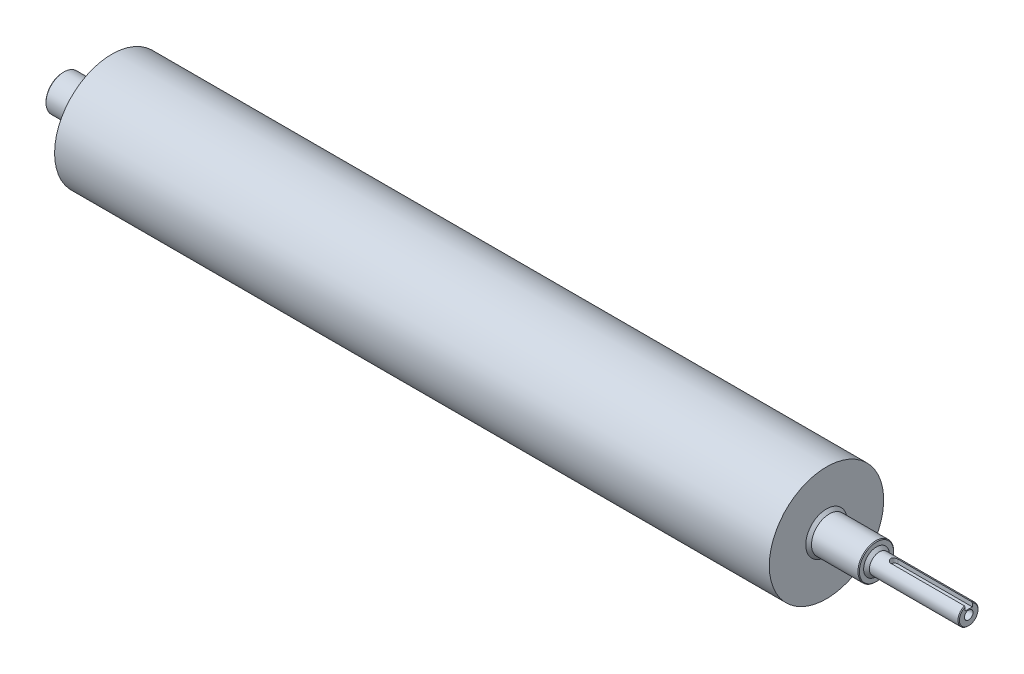
ISO-10303-21;
HEADER;
FILE_DESCRIPTION(('STEP AP214'),'2;1');
FILE_NAME('part.step','',(''),(''),'','','');
FILE_SCHEMA(('AUTOMOTIVE_DESIGN { 1 0 10303 214 1 1 1 1 }'));
ENDSEC;
DATA;
#1=APPLICATION_CONTEXT('core data for automotive mechanical design processes');
#2=APPLICATION_PROTOCOL_DEFINITION('international standard','automotive_design',2000,#1);
#3=PRODUCT_CONTEXT('',#1,'mechanical');
#4=PRODUCT('Part','Part','',(#3));
#5=PRODUCT_RELATED_PRODUCT_CATEGORY('part','',(#4));
#6=PRODUCT_DEFINITION_FORMATION('','',#4);
#7=PRODUCT_DEFINITION_CONTEXT('part definition',#1,'design');
#8=PRODUCT_DEFINITION('design','',#6,#7);
#9=PRODUCT_DEFINITION_SHAPE('','',#8);
#10=(LENGTH_UNIT() NAMED_UNIT(*) SI_UNIT(.MILLI.,.METRE.));
#11=(NAMED_UNIT(*) PLANE_ANGLE_UNIT() SI_UNIT($,.RADIAN.));
#12=(NAMED_UNIT(*) SI_UNIT($,.STERADIAN.) SOLID_ANGLE_UNIT());
#13=UNCERTAINTY_MEASURE_WITH_UNIT(LENGTH_MEASURE(1.E-05),#10,'distance_accuracy_value','');
#14=(GEOMETRIC_REPRESENTATION_CONTEXT(3) GLOBAL_UNCERTAINTY_ASSIGNED_CONTEXT((#13)) GLOBAL_UNIT_ASSIGNED_CONTEXT((#10,
#11,#12)) REPRESENTATION_CONTEXT('',''));
#15=CARTESIAN_POINT('',(0.,0.,0.));
#16=DIRECTION('',(0.,0.,1.));
#17=DIRECTION('',(1.,0.,0.));
#18=AXIS2_PLACEMENT_3D('',#15,#16,#17);
#19=CARTESIAN_POINT('',(633.5,0.,0.));
#20=DIRECTION('',(-1.,0.,0.));
#21=DIRECTION('',(0.,0.,1.));
#22=AXIS2_PLACEMENT_3D('',#19,#20,#21);
#23=CYLINDRICAL_SURFACE('',#22,7.);
#24=CARTESIAN_POINT('',(571.,0.,0.));
#25=DIRECTION('',(1.,0.,0.));
#26=DIRECTION('',(0.,0.,-1.));
#27=AXIS2_PLACEMENT_3D('',#24,#25,#26);
#28=CIRCLE('',#27,7.);
#29=CARTESIAN_POINT('',(571.,0.,-7.));
#30=VERTEX_POINT('',#29);
#31=EDGE_CURVE('E153',#30,#30,#28,.T.);
#32=ORIENTED_EDGE('',*,*,#31,.T.);
#33=EDGE_LOOP('',(#32));
#34=FACE_BOUND('',#33,.T.);
#35=CARTESIAN_POINT('',(581.5,6.53834841531101,-2.5));
#36=CARTESIAN_POINT('',(581.432110754271,6.53833653785132,-2.50000932220905));
#37=CARTESIAN_POINT('',(581.364228067361,6.53940549922738,-2.49723485076695));
#38=CARTESIAN_POINT('',(581.228996089388,6.54361657478134,-2.4861910211816));
#39=CARTESIAN_POINT('',(581.161646641394,6.54675805418062,-2.47792334551208));
#40=CARTESIAN_POINT('',(581.028178585397,6.55501217637942,-2.45600175285901));
#41=CARTESIAN_POINT('',(580.96205666366,6.56011831705675,-2.44236559963956));
#42=CARTESIAN_POINT('',(580.831298164891,6.57213177854174,-2.4098511546665));
#43=CARTESIAN_POINT('',(580.766661653687,6.57903917900746,-2.39097263107437));
#44=CARTESIAN_POINT('',(580.575735633522,6.6021493436571,-2.32673964179204));
#45=CARTESIAN_POINT('',(580.452209547864,6.62075475340845,-2.27375112606985));
#46=CARTESIAN_POINT('',(580.215769666872,6.66225397360711,-2.14910757865423));
#47=CARTESIAN_POINT('',(580.102863683264,6.68515090424876,-2.07743895048848));
#48=CARTESIAN_POINT('',(579.885784786647,6.73379913792223,-1.91402571101971));
#49=CARTESIAN_POINT('',(579.782153524804,6.75962864041371,-1.82158337146746));
#50=CARTESIAN_POINT('',(579.591491295284,6.8105759232303,-1.62073388776333));
#51=CARTESIAN_POINT('',(579.504463420757,6.83569357019867,-1.51232377552677));
#52=CARTESIAN_POINT('',(579.346910144545,6.88331133279045,-1.27853915335939));
#53=CARTESIAN_POINT('',(579.276968478139,6.90570835223796,-1.1527483378919));
#54=CARTESIAN_POINT('',(579.159463353203,6.94442357672633,-0.890250825476675));
#55=CARTESIAN_POINT('',(579.111892220954,6.96074386585465,-0.753547890540354));
#56=CARTESIAN_POINT('',(579.042359397818,6.9849105051071,-0.478829979256188));
#57=CARTESIAN_POINT('',(579.019460869529,6.99306594352515,-0.341079835227478));
#58=CARTESIAN_POINT('',(578.996931597222,7.00108798053822,-0.0634643052969072));
#59=CARTESIAN_POINT('',(578.997294413965,7.00095687302702,0.0764004845074516));
#60=CARTESIAN_POINT('',(579.020711273761,6.99262258049077,0.34759325848696));
#61=CARTESIAN_POINT('',(579.042744794198,6.98478243583516,0.479022407078739));
#62=CARTESIAN_POINT('',(579.107173424159,6.96237832507347,0.736175812143629));
#63=CARTESIAN_POINT('',(579.149569684363,6.94781397899037,0.861899745780483));
#64=CARTESIAN_POINT('',(579.254046911565,6.91316506890368,1.10616102429809));
#65=CARTESIAN_POINT('',(579.31639571496,6.89300592164314,1.22457279066908));
#66=CARTESIAN_POINT('',(579.458779335223,6.8492335561632,1.44953531305525));
#67=CARTESIAN_POINT('',(579.538819523783,6.82561928959263,1.55608245176773));
#68=CARTESIAN_POINT('',(579.719323263657,6.77590547805489,1.76032445256074));
#69=CARTESIAN_POINT('',(579.820649723145,6.74974055843874,1.85724185700423));
#70=CARTESIAN_POINT('',(580.038327364166,6.69890342468975,2.03299914621298));
#71=CARTESIAN_POINT('',(580.154683905168,6.67423174765257,2.1118325545646));
#72=CARTESIAN_POINT('',(580.401942598522,6.62877803875406,2.25049860898455));
#73=CARTESIAN_POINT('',(580.533078975505,6.60807875118995,2.30994207989624));
#74=CARTESIAN_POINT('',(580.804364801582,6.57388213610267,2.4055543972585));
#75=CARTESIAN_POINT('',(580.944499141169,6.56037307165054,2.44176119399954));
#76=CARTESIAN_POINT('',(581.155030544264,6.54708542245562,2.47705497148626));
#77=CARTESIAN_POINT('',(581.223736301772,6.54382010967907,2.48565347586444));
#78=CARTESIAN_POINT('',(581.361615164191,6.53944910829677,2.49712352174881));
#79=CARTESIAN_POINT('',(581.4307876671,6.53834103140935,2.50000139665367));
#80=CARTESIAN_POINT('',(581.5,6.53834841531101,2.5));
#81=B_SPLINE_CURVE_WITH_KNOTS('',3,(#35,#36,#37,#38,#39,#40,#41,#42,#43,#44,#45,#46,#47,#48,#49,
#50,#51,#52,#53,#54,#55,#56,#57,#58,#59,#60,#61,#62,#63,#64,#65,#66,#67,#68,#69,#70,#71,#72,#73,
#74,#75,#76,#77,#78,#79,#80),.UNSPECIFIED.,.F.,.F.,(4,2,2,2,2,2,2,2,2,2,2,2,2,2,2,2,2,2,2,2,2,2,
4),(0.,0.203591628551613,0.407120929225424,0.609982356545697,0.812852756635974,1.21793118555519,
1.62330528148463,2.04515972311929,2.46709267811831,2.90188398965554,3.33652604665234,
3.7540099394086,4.17137826416922,4.56998920861349,4.96862268086887,5.37284909448643,
5.77719841367923,6.20315837945089,6.62927065674716,7.06347329058497,7.49696496492438,
7.70468580162762,7.9121765389639),.UNSPECIFIED.);
#82=CARTESIAN_POINT('',(581.5,6.53834841531101,-2.5));
#83=VERTEX_POINT('',#82);
#84=CARTESIAN_POINT('',(581.5,6.53834841531101,2.5));
#85=VERTEX_POINT('',#84);
#86=EDGE_CURVE('E93',#83,#85,#81,.T.);
#87=ORIENTED_EDGE('',*,*,#86,.F.);
#88=DIRECTION('',(1.,0.,0.));
#89=VECTOR('',#88,1.);
#90=CARTESIAN_POINT('',(581.5,6.53834841531101,-2.5));
#91=LINE('',#90,#89);
#92=CARTESIAN_POINT('',(633.,6.53834841531101,-2.5));
#93=VERTEX_POINT('',#92);
#94=EDGE_CURVE('E105',#83,#93,#91,.T.);
#95=ORIENTED_EDGE('',*,*,#94,.T.);
#96=CARTESIAN_POINT('',(633.,0.,0.));
#97=DIRECTION('',(1.,0.,0.));
#98=DIRECTION('',(0.,0.,-1.));
#99=AXIS2_PLACEMENT_3D('',#96,#97,#98);
#100=CIRCLE('',#99,7.);
#101=CARTESIAN_POINT('',(633.,6.53834841531101,2.5));
#102=VERTEX_POINT('',#101);
#103=EDGE_CURVE('E168',#93,#102,#100,.F.);
#104=ORIENTED_EDGE('',*,*,#103,.T.);
#105=DIRECTION('',(1.,0.,0.));
#106=VECTOR('',#105,1.);
#107=CARTESIAN_POINT('',(581.5,6.53834841531101,2.5));
#108=LINE('',#107,#106);
#109=EDGE_CURVE('E52',#85,#102,#108,.T.);
#110=ORIENTED_EDGE('',*,*,#109,.F.);
#111=EDGE_LOOP('',(#87,#95,#104,#110));
#112=FACE_BOUND('',#111,.T.);
#113=ADVANCED_FACE('F32',(#34,#112),#23,.T.);
#114=CARTESIAN_POINT('',(569.,0.,0.));
#115=DIRECTION('',(-1.,0.,0.));
#116=DIRECTION('',(0.,0.,1.));
#117=AXIS2_PLACEMENT_3D('',#114,#115,#116);
#118=CYLINDRICAL_SURFACE('',#117,12.5);
#119=CARTESIAN_POINT('',(568.5,0.,0.));
#120=DIRECTION('',(1.,0.,0.));
#121=DIRECTION('',(0.,0.,-1.));
#122=AXIS2_PLACEMENT_3D('',#119,#120,#121);
#123=CIRCLE('',#122,12.5);
#124=CARTESIAN_POINT('',(568.5,0.,-12.5));
#125=VERTEX_POINT('',#124);
#126=EDGE_CURVE('E174',#125,#125,#123,.F.);
#127=ORIENTED_EDGE('',*,*,#126,.T.);
#128=EDGE_LOOP('',(#127));
#129=FACE_BOUND('',#128,.T.);
#130=CARTESIAN_POINT('',(536.,0.,0.));
#131=DIRECTION('',(-1.,0.,0.));
#132=DIRECTION('',(0.,0.,1.));
#133=AXIS2_PLACEMENT_3D('',#130,#131,#132);
#134=CIRCLE('',#133,12.5);
#135=CARTESIAN_POINT('',(536.,0.,12.5));
#136=VERTEX_POINT('',#135);
#137=EDGE_CURVE('E150',#136,#136,#134,.F.);
#138=ORIENTED_EDGE('',*,*,#137,.T.);
#139=EDGE_LOOP('',(#138));
#140=FACE_BOUND('',#139,.T.);
#141=ADVANCED_FACE('F227',(#129,#140),#118,.T.);
#142=CARTESIAN_POINT('',(569.,0.,0.));
#143=DIRECTION('',(1.,0.,0.));
#144=DIRECTION('',(0.,0.,-1.));
#145=AXIS2_PLACEMENT_3D('',#142,#143,#144);
#146=PLANE('',#145);
#147=CARTESIAN_POINT('',(569.,0.,0.));
#148=DIRECTION('',(1.,0.,0.));
#149=DIRECTION('',(0.,0.,-1.));
#150=AXIS2_PLACEMENT_3D('',#147,#148,#149);
#151=CIRCLE('',#150,12.);
#152=CARTESIAN_POINT('',(569.,0.,-12.));
#153=VERTEX_POINT('',#152);
#154=EDGE_CURVE('E171',#153,#153,#151,.T.);
#155=ORIENTED_EDGE('',*,*,#154,.T.);
#156=EDGE_LOOP('',(#155));
#157=FACE_BOUND('',#156,.T.);
#158=CARTESIAN_POINT('',(569.,0.,0.));
#159=DIRECTION('',(1.,0.,0.));
#160=DIRECTION('',(0.,0.,-1.));
#161=AXIS2_PLACEMENT_3D('',#158,#159,#160);
#162=CIRCLE('',#161,9.00000000000017);
#163=CARTESIAN_POINT('',(569.,0.,-9.00000000000017));
#164=VERTEX_POINT('',#163);
#165=EDGE_CURVE('E156',#164,#164,#162,.F.);
#166=ORIENTED_EDGE('',*,*,#165,.T.);
#167=EDGE_LOOP('',(#166));
#168=FACE_BOUND('',#167,.T.);
#169=ADVANCED_FACE('F222',(#157,#168),#146,.T.);
#170=CARTESIAN_POINT('',(633.5,0.,0.));
#171=DIRECTION('',(1.,0.,0.));
#172=DIRECTION('',(0.,0.,-1.));
#173=AXIS2_PLACEMENT_3D('',#170,#171,#172);
#174=PLANE('',#173);
#175=DIRECTION('',(0.,1.,0.));
#176=VECTOR('',#175,1.);
#177=CARTESIAN_POINT('',(633.5,6.53834841531101,-2.5));
#178=LINE('',#177,#176);
#179=CARTESIAN_POINT('',(633.5,3.65,-2.5));
#180=VERTEX_POINT('',#179);
#181=CARTESIAN_POINT('',(633.5,6.00000000000001,-2.5));
#182=VERTEX_POINT('',#181);
#183=EDGE_CURVE('E118',#180,#182,#178,.T.);
#184=ORIENTED_EDGE('',*,*,#183,.F.);
#185=DIRECTION('',(0.,0.,-1.));
#186=VECTOR('',#185,1.);
#187=CARTESIAN_POINT('',(633.5,3.65,2.5));
#188=LINE('',#187,#186);
#189=CARTESIAN_POINT('',(633.5,3.65,2.5));
#190=VERTEX_POINT('',#189);
#191=EDGE_CURVE('E99',#190,#180,#188,.T.);
#192=ORIENTED_EDGE('',*,*,#191,.F.);
#193=DIRECTION('',(0.,-1.,0.));
#194=VECTOR('',#193,1.);
#195=CARTESIAN_POINT('',(633.5,6.53834841531101,2.5));
#196=LINE('',#195,#194);
#197=CARTESIAN_POINT('',(633.5,6.00000000000001,2.5));
#198=VERTEX_POINT('',#197);
#199=EDGE_CURVE('E108',#198,#190,#196,.T.);
#200=ORIENTED_EDGE('',*,*,#199,.F.);
#201=CARTESIAN_POINT('',(633.5,0.,0.));
#202=DIRECTION('',(1.,0.,0.));
#203=DIRECTION('',(0.,0.,-1.));
#204=AXIS2_PLACEMENT_3D('',#201,#202,#203);
#205=CIRCLE('',#204,6.50000000000001);
#206=EDGE_CURVE('E165',#198,#182,#205,.T.);
#207=ORIENTED_EDGE('',*,*,#206,.T.);
#208=EDGE_LOOP('',(#184,#192,#200,#207));
#209=FACE_BOUND('',#208,.T.);
#210=CARTESIAN_POINT('',(633.5,0.,0.));
#211=DIRECTION('',(1.,0.,0.));
#212=DIRECTION('',(0.,0.,-1.));
#213=AXIS2_PLACEMENT_3D('',#210,#211,#212);
#214=CIRCLE('',#213,3.);
#215=CARTESIAN_POINT('',(633.5,0.,-3.));
#216=VERTEX_POINT('',#215);
#217=EDGE_CURVE('E133',#216,#216,#214,.T.);
#218=ORIENTED_EDGE('',*,*,#217,.F.);
#219=EDGE_LOOP('',(#218));
#220=FACE_BOUND('',#219,.T.);
#221=ADVANCED_FACE('F219',(#209,#220),#174,.T.);
#222=CARTESIAN_POINT('',(613.5,0.,0.));
#223=DIRECTION('',(1.,0.,0.));
#224=DIRECTION('',(0.,0.,-1.));
#225=AXIS2_PLACEMENT_3D('',#222,#223,#224);
#226=CYLINDRICAL_SURFACE('',#225,3.);
#227=CARTESIAN_POINT('',(613.5,0.,0.));
#228=DIRECTION('',(1.,0.,0.));
#229=DIRECTION('',(0.,0.,-1.));
#230=AXIS2_PLACEMENT_3D('',#227,#228,#229);
#231=CIRCLE('',#230,3.);
#232=CARTESIAN_POINT('',(613.5,0.,-3.));
#233=VERTEX_POINT('',#232);
#234=EDGE_CURVE('E136',#233,#233,#231,.T.);
#235=ORIENTED_EDGE('',*,*,#234,.F.);
#236=EDGE_LOOP('',(#235));
#237=FACE_BOUND('',#236,.T.);
#238=ORIENTED_EDGE('',*,*,#217,.T.);
#239=EDGE_LOOP('',(#238));
#240=FACE_BOUND('',#239,.T.);
#241=ADVANCED_FACE('F215',(#237,#240),#226,.F.);
#242=CARTESIAN_POINT('',(613.5,0.,0.));
#243=DIRECTION('',(1.,0.,0.));
#244=DIRECTION('',(0.,0.,-1.));
#245=AXIS2_PLACEMENT_3D('',#242,#243,#244);
#246=PLANE('',#245);
#247=ORIENTED_EDGE('',*,*,#234,.T.);
#248=EDGE_LOOP('',(#247));
#249=FACE_BOUND('',#248,.T.);
#250=ADVANCED_FACE('F195',(#249),#246,.T.);
#251=CARTESIAN_POINT('',(534.,0.,0.));
#252=DIRECTION('',(-1.,0.,0.));
#253=DIRECTION('',(0.,0.,1.));
#254=AXIS2_PLACEMENT_3D('',#251,#252,#253);
#255=PLANE('',#254);
#256=CARTESIAN_POINT('',(534.,0.,0.));
#257=DIRECTION('',(-1.,0.,0.));
#258=DIRECTION('',(0.,0.,1.));
#259=AXIS2_PLACEMENT_3D('',#256,#257,#258);
#260=CIRCLE('',#259,14.5);
#261=CARTESIAN_POINT('',(534.,0.,14.5));
#262=VERTEX_POINT('',#261);
#263=EDGE_CURVE('E147',#262,#262,#260,.T.);
#264=ORIENTED_EDGE('',*,*,#263,.T.);
#265=EDGE_LOOP('',(#264));
#266=FACE_BOUND('',#265,.T.);
#267=CARTESIAN_POINT('',(534.,0.,0.));
#268=DIRECTION('',(-1.,0.,0.));
#269=DIRECTION('',(0.,0.,1.));
#270=AXIS2_PLACEMENT_3D('',#267,#268,#269);
#271=CIRCLE('',#270,40.);
#272=CARTESIAN_POINT('',(534.,0.,40.));
#273=VERTEX_POINT('',#272);
#274=EDGE_CURVE('E124',#273,#273,#271,.T.);
#275=ORIENTED_EDGE('',*,*,#274,.F.);
#276=EDGE_LOOP('',(#275));
#277=FACE_BOUND('',#276,.T.);
#278=ADVANCED_FACE('F191',(#266,#277),#255,.F.);
#279=CARTESIAN_POINT('',(34.,0.,0.));
#280=DIRECTION('',(-1.,0.,0.));
#281=DIRECTION('',(0.,0.,1.));
#282=AXIS2_PLACEMENT_3D('',#279,#280,#281);
#283=PLANE('',#282);
#284=CARTESIAN_POINT('',(34.,0.,0.));
#285=DIRECTION('',(-1.,0.,0.));
#286=DIRECTION('',(0.,0.,1.));
#287=AXIS2_PLACEMENT_3D('',#284,#285,#286);
#288=CIRCLE('',#287,14.5);
#289=CARTESIAN_POINT('',(34.,0.,14.5));
#290=VERTEX_POINT('',#289);
#291=EDGE_CURVE('E144',#290,#290,#288,.F.);
#292=ORIENTED_EDGE('',*,*,#291,.T.);
#293=EDGE_LOOP('',(#292));
#294=FACE_BOUND('',#293,.T.);
#295=CARTESIAN_POINT('',(34.,0.,0.));
#296=DIRECTION('',(-1.,0.,0.));
#297=DIRECTION('',(0.,0.,1.));
#298=AXIS2_PLACEMENT_3D('',#295,#296,#297);
#299=CIRCLE('',#298,40.);
#300=CARTESIAN_POINT('',(34.,0.,40.));
#301=VERTEX_POINT('',#300);
#302=EDGE_CURVE('E101',#301,#301,#299,.T.);
#303=ORIENTED_EDGE('',*,*,#302,.T.);
#304=EDGE_LOOP('',(#303));
#305=FACE_BOUND('',#304,.T.);
#306=ADVANCED_FACE('F194',(#294,#305),#283,.T.);
#307=CARTESIAN_POINT('',(534.,0.,0.));
#308=DIRECTION('',(-1.,0.,0.));
#309=DIRECTION('',(0.,0.,1.));
#310=AXIS2_PLACEMENT_3D('',#307,#308,#309);
#311=CYLINDRICAL_SURFACE('',#310,40.);
#312=ORIENTED_EDGE('',*,*,#274,.T.);
#313=EDGE_LOOP('',(#312));
#314=FACE_BOUND('',#313,.T.);
#315=ORIENTED_EDGE('',*,*,#302,.F.);
#316=EDGE_LOOP('',(#315));
#317=FACE_BOUND('',#316,.T.);
#318=ADVANCED_FACE('F199',(#314,#317),#311,.T.);
#319=CARTESIAN_POINT('',(20.,0.,0.));
#320=DIRECTION('',(-1.,0.,0.));
#321=DIRECTION('',(0.,0.,1.));
#322=AXIS2_PLACEMENT_3D('',#319,#320,#321);
#323=PLANE('',#322);
#324=CARTESIAN_POINT('',(20.,0.,0.));
#325=DIRECTION('',(-1.,0.,0.));
#326=DIRECTION('',(0.,0.,1.));
#327=AXIS2_PLACEMENT_3D('',#324,#325,#326);
#328=CIRCLE('',#327,3.);
#329=CARTESIAN_POINT('',(20.,0.,3.));
#330=VERTEX_POINT('',#329);
#331=EDGE_CURVE('E130',#330,#330,#328,.T.);
#332=ORIENTED_EDGE('',*,*,#331,.T.);
#333=EDGE_LOOP('',(#332));
#334=FACE_BOUND('',#333,.T.);
#335=ADVANCED_FACE('F203',(#334),#323,.T.);
#336=CARTESIAN_POINT('',(20.,0.,0.));
#337=DIRECTION('',(-1.,0.,0.));
#338=DIRECTION('',(0.,0.,1.));
#339=AXIS2_PLACEMENT_3D('',#336,#337,#338);
#340=CYLINDRICAL_SURFACE('',#339,3.);
#341=ORIENTED_EDGE('',*,*,#331,.F.);
#342=EDGE_LOOP('',(#341));
#343=FACE_BOUND('',#342,.T.);
#344=CARTESIAN_POINT('',(0.,0.,0.));
#345=DIRECTION('',(-1.,0.,0.));
#346=DIRECTION('',(0.,0.,1.));
#347=AXIS2_PLACEMENT_3D('',#344,#345,#346);
#348=CIRCLE('',#347,3.);
#349=CARTESIAN_POINT('',(0.,0.,3.));
#350=VERTEX_POINT('',#349);
#351=EDGE_CURVE('E127',#350,#350,#348,.T.);
#352=ORIENTED_EDGE('',*,*,#351,.T.);
#353=EDGE_LOOP('',(#352));
#354=FACE_BOUND('',#353,.T.);
#355=ADVANCED_FACE('F207',(#343,#354),#340,.F.);
#356=CARTESIAN_POINT('',(0.,0.,0.));
#357=DIRECTION('',(1.,0.,0.));
#358=DIRECTION('',(0.,0.,-1.));
#359=AXIS2_PLACEMENT_3D('',#356,#357,#358);
#360=PLANE('',#359);
#361=CARTESIAN_POINT('',(0.,0.,0.));
#362=DIRECTION('',(1.,0.,0.));
#363=DIRECTION('',(0.,0.,-1.));
#364=AXIS2_PLACEMENT_3D('',#361,#362,#363);
#365=CIRCLE('',#364,12.0000000000002);
#366=CARTESIAN_POINT('',(0.,0.,-12.0000000000002));
#367=VERTEX_POINT('',#366);
#368=EDGE_CURVE('E162',#367,#367,#365,.F.);
#369=ORIENTED_EDGE('',*,*,#368,.T.);
#370=EDGE_LOOP('',(#369));
#371=FACE_BOUND('',#370,.T.);
#372=ORIENTED_EDGE('',*,*,#351,.F.);
#373=EDGE_LOOP('',(#372));
#374=FACE_BOUND('',#373,.T.);
#375=ADVANCED_FACE('F211',(#371,#374),#360,.F.);
#376=CARTESIAN_POINT('',(0.499999999999834,0.,0.));
#377=DIRECTION('',(1.,0.,0.));
#378=DIRECTION('',(0.,0.,-1.));
#379=AXIS2_PLACEMENT_3D('',#376,#377,#378);
#380=CIRCLE('',#379,12.5);
#381=CARTESIAN_POINT('',(0.499999999999834,0.,-12.5));
#382=VERTEX_POINT('',#381);
#383=EDGE_CURVE('E159',#382,#382,#380,.T.);
#384=ORIENTED_EDGE('',*,*,#383,.T.);
#385=EDGE_LOOP('',(#384));
#386=FACE_BOUND('',#385,.T.);
#387=CARTESIAN_POINT('',(32.,0.,0.));
#388=DIRECTION('',(-1.,0.,0.));
#389=DIRECTION('',(0.,0.,1.));
#390=AXIS2_PLACEMENT_3D('',#387,#388,#389);
#391=CIRCLE('',#390,12.5);
#392=CARTESIAN_POINT('',(32.,0.,12.5));
#393=VERTEX_POINT('',#392);
#394=EDGE_CURVE('E139',#393,#393,#391,.T.);
#395=ORIENTED_EDGE('',*,*,#394,.T.);
#396=EDGE_LOOP('',(#395));
#397=FACE_BOUND('',#396,.T.);
#398=ADVANCED_FACE('F234',(#386,#397),#118,.T.);
#399=CARTESIAN_POINT('',(32.,0.,0.));
#400=DIRECTION('',(1.,0.,0.));
#401=DIRECTION('',(0.,0.,-1.));
#402=AXIS2_PLACEMENT_3D('',#399,#400,#401);
#403=CONICAL_SURFACE('',#402,12.5,0.785398163397451);
#404=ORIENTED_EDGE('',*,*,#291,.F.);
#405=EDGE_LOOP('',(#404));
#406=FACE_BOUND('',#405,.T.);
#407=ORIENTED_EDGE('',*,*,#394,.F.);
#408=EDGE_LOOP('',(#407));
#409=FACE_BOUND('',#408,.T.);
#410=ADVANCED_FACE('F238',(#406,#409),#403,.T.);
#411=CARTESIAN_POINT('',(534.,0.,0.));
#412=DIRECTION('',(-1.,0.,0.));
#413=DIRECTION('',(0.,0.,1.));
#414=AXIS2_PLACEMENT_3D('',#411,#412,#413);
#415=CONICAL_SURFACE('',#414,14.5,0.78539816339745);
#416=ORIENTED_EDGE('',*,*,#137,.F.);
#417=EDGE_LOOP('',(#416));
#418=FACE_BOUND('',#417,.T.);
#419=ORIENTED_EDGE('',*,*,#263,.F.);
#420=EDGE_LOOP('',(#419));
#421=FACE_BOUND('',#420,.T.);
#422=ADVANCED_FACE('F242',(#418,#421),#415,.T.);
#423=CARTESIAN_POINT('',(571.,0.,0.));
#424=DIRECTION('',(-1.,0.,0.));
#425=DIRECTION('',(0.,0.,1.));
#426=AXIS2_PLACEMENT_3D('',#423,#424,#425);
#427=CONICAL_SURFACE('',#426,7.,0.785398163397464);
#428=ORIENTED_EDGE('',*,*,#165,.F.);
#429=EDGE_LOOP('',(#428));
#430=FACE_BOUND('',#429,.T.);
#431=ORIENTED_EDGE('',*,*,#31,.F.);
#432=EDGE_LOOP('',(#431));
#433=FACE_BOUND('',#432,.T.);
#434=ADVANCED_FACE('F246',(#430,#433),#427,.T.);
#435=CARTESIAN_POINT('',(0.499999999999834,0.,0.));
#436=DIRECTION('',(1.,0.,0.));
#437=DIRECTION('',(0.,0.,-1.));
#438=AXIS2_PLACEMENT_3D('',#435,#436,#437);
#439=CONICAL_SURFACE('',#438,12.5,0.785398163397438);
#440=ORIENTED_EDGE('',*,*,#368,.F.);
#441=EDGE_LOOP('',(#440));
#442=FACE_BOUND('',#441,.T.);
#443=ORIENTED_EDGE('',*,*,#383,.F.);
#444=EDGE_LOOP('',(#443));
#445=FACE_BOUND('',#444,.T.);
#446=ADVANCED_FACE('F249',(#442,#445),#439,.T.);
#447=CARTESIAN_POINT('',(633.5,0.,0.));
#448=DIRECTION('',(-1.,0.,0.));
#449=DIRECTION('',(0.,0.,1.));
#450=AXIS2_PLACEMENT_3D('',#447,#448,#449);
#451=CONICAL_SURFACE('',#450,6.50000000000001,0.785398163397387);
#452=CARTESIAN_POINT('',(636.763406282255,2.05561156198136,-2.5));
#453=CARTESIAN_POINT('',(636.720647670997,2.12291946889995,-2.5));
#454=CARTESIAN_POINT('',(636.677016323681,2.18966321374387,-2.5));
#455=CARTESIAN_POINT('',(636.588268185576,2.32214271506774,-2.5));
#456=CARTESIAN_POINT('',(636.543151615,2.38787861888032,-2.5));
#457=CARTESIAN_POINT('',(636.405995934129,2.58371127758987,-2.5));
#458=CARTESIAN_POINT('',(636.312102320112,2.71250819066264,-2.5));
#459=CARTESIAN_POINT('',(636.120882739203,2.96725546398873,-2.5));
#460=CARTESIAN_POINT('',(636.023561187644,3.09320916616127,-2.5));
#461=CARTESIAN_POINT('',(635.826261932948,3.34304620393511,-2.5));
#462=CARTESIAN_POINT('',(635.726283797111,3.46692919684293,-2.5));
#463=CARTESIAN_POINT('',(635.524502415054,3.71281605849721,-2.5));
#464=CARTESIAN_POINT('',(635.4227028394,3.83482294843263,-2.5));
#465=CARTESIAN_POINT('',(635.217546169393,4.07750531951185,-2.5));
#466=CARTESIAN_POINT('',(635.114189163745,4.19818087580832,-2.5));
#467=CARTESIAN_POINT('',(634.802209502645,4.55868748817919,-2.5));
#468=CARTESIAN_POINT('',(634.591741870794,4.79692180076185,-2.5));
#469=CARTESIAN_POINT('',(634.290344287042,5.13342841595519,-2.5));
#470=CARTESIAN_POINT('',(634.200738088836,5.23289613459466,-2.5));
#471=CARTESIAN_POINT('',(634.02103513267,5.43137252510834,-2.5));
#472=CARTESIAN_POINT('',(633.930938417944,5.5303812360588,-2.5));
#473=CARTESIAN_POINT('',(633.659943100962,5.8268998423724,-2.5));
#474=CARTESIAN_POINT('',(633.478407028183,6.02382684154269,-2.5));
#475=CARTESIAN_POINT('',(632.989318800121,6.55095044177167,-2.5));
#476=CARTESIAN_POINT('',(632.680600108071,6.88006345284734,-2.5));
#477=CARTESIAN_POINT('',(632.060806228438,7.53606226093692,-2.5));
#478=CARTESIAN_POINT('',(631.749731021786,7.86294803988787,-2.5));
#479=CARTESIAN_POINT('',(631.126308710475,8.51478120250814,-2.5));
#480=CARTESIAN_POINT('',(630.813963487207,8.83973038738381,-2.5));
#481=CARTESIAN_POINT('',(630.188078599506,9.48845569113512,-2.5));
#482=CARTESIAN_POINT('',(629.87453897582,9.81223184930491,-2.5));
#483=CARTESIAN_POINT('',(629.560608326694,10.1356252154807,-2.5));
#484=B_SPLINE_CURVE_WITH_KNOTS('',3,(#452,#453,#454,#455,#456,#457,#458,#459,#460,#461,#462,
#463,#464,#465,#466,#467,#468,#469,#470,#471,#472,#473,#474,#475,#476,#477,#478,#479,#480,#481,
#482,#483),.UNSPECIFIED.,.F.,.F.,(4,2,2,2,2,2,2,2,2,2,2,2,2,2,2,4),(0.,0.239204289040653,
0.478373269688448,0.956442900657989,1.43391778928085,1.91147093080832,2.38815106654845,
2.86480415497765,3.81840928247236,4.22004072000316,4.62163731375572,5.42513442577414,
6.77885159195288,8.13257972380231,9.48474609101336,10.8368667364955),.UNSPECIFIED.);
#485=EDGE_CURVE('E11',#182,#93,#484,.T.);
#486=ORIENTED_EDGE('',*,*,#485,.F.);
#487=ORIENTED_EDGE('',*,*,#206,.F.);
#488=CARTESIAN_POINT('',(629.560608326694,10.1356252154807,2.5));
#489=CARTESIAN_POINT('',(629.874939782886,9.81181853300378,2.5));
#490=CARTESIAN_POINT('',(630.188879564281,9.48762831871975,2.5));
#491=CARTESIAN_POINT('',(630.815492668951,8.83814244738083,2.5));
#492=CARTESIAN_POINT('',(631.128166215601,8.51284700574061,2.5));
#493=CARTESIAN_POINT('',(631.751514657877,7.86107516160865,2.5));
#494=CARTESIAN_POINT('',(632.06219146688,7.5346005907005,2.5));
#495=CARTESIAN_POINT('',(632.681257914743,6.87936266783043,2.5));
#496=CARTESIAN_POINT('',(632.989647093732,6.55059888012229,2.5));
#497=CARTESIAN_POINT('',(633.449829797428,6.0546253304344,2.5));
#498=CARTESIAN_POINT('',(633.602971436351,5.88866692181282,2.5));
#499=CARTESIAN_POINT('',(633.908096481998,5.55569520719304,2.5));
#500=CARTESIAN_POINT('',(634.060079918069,5.38868192812231,2.5));
#501=CARTESIAN_POINT('',(634.362487727648,5.05339353210887,2.5));
#502=CARTESIAN_POINT('',(634.512912815355,4.88511906020129,2.5));
#503=CARTESIAN_POINT('',(634.811816293218,4.54681651062759,2.5));
#504=CARTESIAN_POINT('',(634.960294493447,4.37678826472347,2.5));
#505=CARTESIAN_POINT('',(635.25484391445,4.0341282385271,2.5));
#506=CARTESIAN_POINT('',(635.40091038303,3.86149236447776,2.5));
#507=CARTESIAN_POINT('',(635.689253642288,3.5131382748118,2.5));
#508=CARTESIAN_POINT('',(635.831531440037,3.33742089931153,2.5));
#509=CARTESIAN_POINT('',(636.040901219645,3.07042179251093,2.5));
#510=CARTESIAN_POINT('',(636.110074202574,2.98077328049473,2.5));
#511=CARTESIAN_POINT('',(636.246675959279,2.80016678933021,2.5));
#512=CARTESIAN_POINT('',(636.314104887968,2.70920892760852,2.5));
#513=CARTESIAN_POINT('',(636.446861097605,2.52563715514851,2.5));
#514=CARTESIAN_POINT('',(636.512186418074,2.43302181799555,2.5));
#515=CARTESIAN_POINT('',(636.640051660151,2.24585019482836,2.5));
#516=CARTESIAN_POINT('',(636.702590713741,2.15129331717595,2.5));
#517=CARTESIAN_POINT('',(636.763406282255,2.05561156198137,2.5));
#518=B_SPLINE_CURVE_WITH_KNOTS('',3,(#488,#489,#490,#491,#492,#493,#494,#495,#496,#497,#498,
#499,#500,#501,#502,#503,#504,#505,#506,#507,#508,#509,#510,#511,#512,#513,#514,#515,#516,#517),
.UNSPECIFIED.,.F.,.F.,(4,2,2,2,2,2,2,2,2,2,2,2,2,2,4),(0.,1.35384801579792,2.70744577704101,
4.05945665030921,5.4117323218604,6.08918752002054,6.76662549425583,7.44373788239743,
8.12091584087722,8.79929856053951,9.47749912120906,9.81718213342873,10.1568348692777,
10.4967954889714,10.8368612878829),.UNSPECIFIED.);
#519=EDGE_CURVE('E45',#102,#198,#518,.T.);
#520=ORIENTED_EDGE('',*,*,#519,.F.);
#521=ORIENTED_EDGE('',*,*,#103,.F.);
#522=EDGE_LOOP('',(#486,#487,#520,#521));
#523=FACE_BOUND('',#522,.T.);
#524=ADVANCED_FACE('F181',(#523),#451,.T.);
#525=CARTESIAN_POINT('',(569.,0.,0.));
#526=DIRECTION('',(-1.,0.,0.));
#527=DIRECTION('',(0.,0.,1.));
#528=AXIS2_PLACEMENT_3D('',#525,#526,#527);
#529=CONICAL_SURFACE('',#528,12.,0.785398163397382);
#530=ORIENTED_EDGE('',*,*,#126,.F.);
#531=EDGE_LOOP('',(#530));
#532=FACE_BOUND('',#531,.T.);
#533=ORIENTED_EDGE('',*,*,#154,.F.);
#534=EDGE_LOOP('',(#533));
#535=FACE_BOUND('',#534,.T.);
#536=ADVANCED_FACE('F34',(#532,#535),#529,.T.);
#537=CARTESIAN_POINT('',(581.5,6.53834841531101,-2.5));
#538=DIRECTION('',(0.,0.,-1.));
#539=DIRECTION('',(0.,1.,0.));
#540=AXIS2_PLACEMENT_3D('',#537,#538,#539);
#541=PLANE('',#540);
#542=ORIENTED_EDGE('',*,*,#485,.T.);
#543=ORIENTED_EDGE('',*,*,#94,.F.);
#544=DIRECTION('',(0.,1.,0.));
#545=VECTOR('',#544,1.);
#546=CARTESIAN_POINT('',(581.5,6.53834841531101,-2.5));
#547=LINE('',#546,#545);
#548=CARTESIAN_POINT('',(581.5,3.65,-2.5));
#549=VERTEX_POINT('',#548);
#550=EDGE_CURVE('E87',#549,#83,#547,.T.);
#551=ORIENTED_EDGE('',*,*,#550,.F.);
#552=DIRECTION('',(1.,0.,0.));
#553=VECTOR('',#552,1.);
#554=CARTESIAN_POINT('',(581.5,3.65,-2.5));
#555=LINE('',#554,#553);
#556=EDGE_CURVE('E96',#549,#180,#555,.T.);
#557=ORIENTED_EDGE('',*,*,#556,.T.);
#558=ORIENTED_EDGE('',*,*,#183,.T.);
#559=EDGE_LOOP('',(#542,#543,#551,#557,#558));
#560=FACE_BOUND('',#559,.T.);
#561=ADVANCED_FACE('F104',(#560),#541,.F.);
#562=CARTESIAN_POINT('',(581.5,3.65,2.5));
#563=DIRECTION('',(0.,-1.,0.));
#564=DIRECTION('',(0.,0.,-1.));
#565=AXIS2_PLACEMENT_3D('',#562,#563,#564);
#566=PLANE('',#565);
#567=ORIENTED_EDGE('',*,*,#191,.T.);
#568=ORIENTED_EDGE('',*,*,#556,.F.);
#569=CARTESIAN_POINT('',(581.5,3.65,0.));
#570=DIRECTION('',(0.,1.,0.));
#571=DIRECTION('',(0.,0.,1.));
#572=AXIS2_PLACEMENT_3D('',#569,#570,#571);
#573=CIRCLE('',#572,2.5);
#574=CARTESIAN_POINT('',(581.5,3.65,2.5));
#575=VERTEX_POINT('',#574);
#576=EDGE_CURVE('E83',#549,#575,#573,.T.);
#577=ORIENTED_EDGE('',*,*,#576,.T.);
#578=DIRECTION('',(1.,0.,0.));
#579=VECTOR('',#578,1.);
#580=CARTESIAN_POINT('',(581.5,3.65,2.5));
#581=LINE('',#580,#579);
#582=EDGE_CURVE('E102',#575,#190,#581,.T.);
#583=ORIENTED_EDGE('',*,*,#582,.T.);
#584=EDGE_LOOP('',(#567,#568,#577,#583));
#585=FACE_BOUND('',#584,.T.);
#586=ADVANCED_FACE('F97',(#585),#566,.F.);
#587=CARTESIAN_POINT('',(581.5,6.53834841531101,2.5));
#588=DIRECTION('',(0.,0.,1.));
#589=DIRECTION('',(1.,0.,0.));
#590=AXIS2_PLACEMENT_3D('',#587,#588,#589);
#591=PLANE('',#590);
#592=ORIENTED_EDGE('',*,*,#519,.T.);
#593=ORIENTED_EDGE('',*,*,#199,.T.);
#594=ORIENTED_EDGE('',*,*,#582,.F.);
#595=DIRECTION('',(0.,-1.,0.));
#596=VECTOR('',#595,1.);
#597=CARTESIAN_POINT('',(581.5,6.53834841531101,2.5));
#598=LINE('',#597,#596);
#599=EDGE_CURVE('E89',#85,#575,#598,.T.);
#600=ORIENTED_EDGE('',*,*,#599,.F.);
#601=ORIENTED_EDGE('',*,*,#109,.T.);
#602=EDGE_LOOP('',(#592,#593,#594,#600,#601));
#603=FACE_BOUND('',#602,.T.);
#604=ADVANCED_FACE('F184',(#603),#591,.F.);
#605=CARTESIAN_POINT('',(581.5,13.65,0.));
#606=DIRECTION('',(0.,-1.,0.));
#607=DIRECTION('',(0.,0.,-1.));
#608=AXIS2_PLACEMENT_3D('',#605,#606,#607);
#609=CYLINDRICAL_SURFACE('',#608,2.5);
#610=ORIENTED_EDGE('',*,*,#86,.T.);
#611=ORIENTED_EDGE('',*,*,#599,.T.);
#612=ORIENTED_EDGE('',*,*,#576,.F.);
#613=ORIENTED_EDGE('',*,*,#550,.T.);
#614=EDGE_LOOP('',(#610,#611,#612,#613));
#615=FACE_BOUND('',#614,.T.);
#616=ADVANCED_FACE('F85',(#615),#609,.F.);
#617=CLOSED_SHELL('',(#113,#141,#169,#221,#241,#250,#278,#306,#318,#335,#355,#375,#398,#410,
#422,#434,#446,#524,#536,#561,#586,#604,#616));
#618=MANIFOLD_SOLID_BREP('B2',#617);
#619=ADVANCED_BREP_SHAPE_REPRESENTATION('',(#18,#618),#14);
#620=SHAPE_DEFINITION_REPRESENTATION(#9,#619);
ENDSEC;
END-ISO-10303-21;
